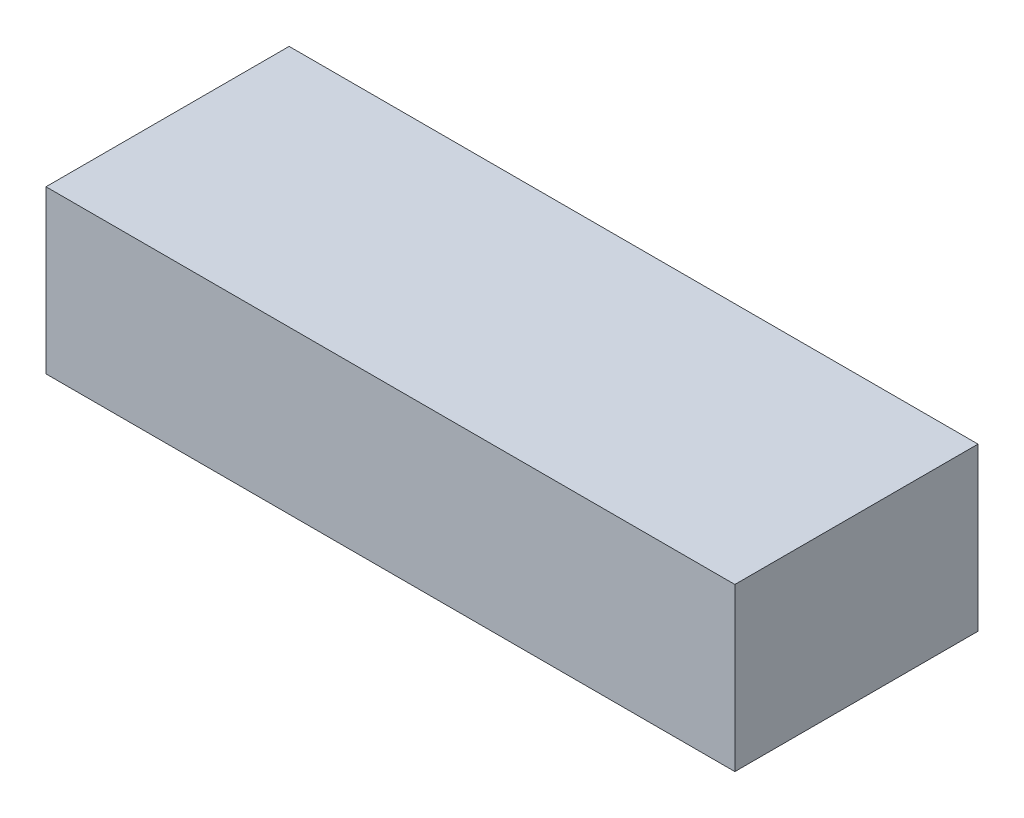
ISO-10303-21;
HEADER;
FILE_DESCRIPTION(('STEP AP214'),'2;1');
FILE_NAME('part.step','',(''),(''),'','','');
FILE_SCHEMA(('AUTOMOTIVE_DESIGN { 1 0 10303 214 1 1 1 1 }'));
ENDSEC;
DATA;
#1=APPLICATION_CONTEXT('core data for automotive mechanical design processes');
#2=APPLICATION_PROTOCOL_DEFINITION('international standard','automotive_design',2000,#1);
#3=PRODUCT_CONTEXT('',#1,'mechanical');
#4=PRODUCT('Part','Part','',(#3));
#5=PRODUCT_RELATED_PRODUCT_CATEGORY('part','',(#4));
#6=PRODUCT_DEFINITION_FORMATION('','',#4);
#7=PRODUCT_DEFINITION_CONTEXT('part definition',#1,'design');
#8=PRODUCT_DEFINITION('design','',#6,#7);
#9=PRODUCT_DEFINITION_SHAPE('','',#8);
#10=(LENGTH_UNIT() NAMED_UNIT(*) SI_UNIT(.MILLI.,.METRE.));
#11=(NAMED_UNIT(*) PLANE_ANGLE_UNIT() SI_UNIT($,.RADIAN.));
#12=(NAMED_UNIT(*) SI_UNIT($,.STERADIAN.) SOLID_ANGLE_UNIT());
#13=UNCERTAINTY_MEASURE_WITH_UNIT(LENGTH_MEASURE(1.E-05),#10,'distance_accuracy_value','');
#14=(GEOMETRIC_REPRESENTATION_CONTEXT(3) GLOBAL_UNCERTAINTY_ASSIGNED_CONTEXT((#13)) GLOBAL_UNIT_ASSIGNED_CONTEXT((#10,
#11,#12)) REPRESENTATION_CONTEXT('',''));
#15=CARTESIAN_POINT('',(0.,0.,0.));
#16=DIRECTION('',(0.,0.,1.));
#17=DIRECTION('',(1.,0.,0.));
#18=AXIS2_PLACEMENT_3D('',#15,#16,#17);
#19=CARTESIAN_POINT('',(34.,16.,12.));
#20=DIRECTION('',(-1.,0.,0.));
#21=DIRECTION('',(0.,0.,1.));
#22=AXIS2_PLACEMENT_3D('',#19,#20,#21);
#23=PLANE('',#22);
#24=DIRECTION('',(0.,0.,-1.));
#25=VECTOR('',#24,1.);
#26=CARTESIAN_POINT('',(34.,0.,12.));
#27=LINE('',#26,#25);
#28=CARTESIAN_POINT('',(34.,0.,12.));
#29=VERTEX_POINT('',#28);
#30=CARTESIAN_POINT('',(34.,0.,-12.));
#31=VERTEX_POINT('',#30);
#32=EDGE_CURVE('E104',#29,#31,#27,.T.);
#33=ORIENTED_EDGE('',*,*,#32,.T.);
#34=DIRECTION('',(0.,-1.,0.));
#35=VECTOR('',#34,1.);
#36=CARTESIAN_POINT('',(34.,16.,-12.));
#37=LINE('',#36,#35);
#38=CARTESIAN_POINT('',(34.,16.,-12.));
#39=VERTEX_POINT('',#38);
#40=EDGE_CURVE('E11',#39,#31,#37,.T.);
#41=ORIENTED_EDGE('',*,*,#40,.F.);
#42=DIRECTION('',(0.,0.,-1.));
#43=VECTOR('',#42,1.);
#44=CARTESIAN_POINT('',(34.,16.,12.));
#45=LINE('',#44,#43);
#46=CARTESIAN_POINT('',(34.,16.,12.));
#47=VERTEX_POINT('',#46);
#48=EDGE_CURVE('E92',#47,#39,#45,.T.);
#49=ORIENTED_EDGE('',*,*,#48,.F.);
#50=DIRECTION('',(0.,-1.,0.));
#51=VECTOR('',#50,1.);
#52=CARTESIAN_POINT('',(34.,16.,12.));
#53=LINE('',#52,#51);
#54=EDGE_CURVE('E100',#47,#29,#53,.T.);
#55=ORIENTED_EDGE('',*,*,#54,.T.);
#56=EDGE_LOOP('',(#33,#41,#49,#55));
#57=FACE_BOUND('',#56,.T.);
#58=ADVANCED_FACE('F41',(#57),#23,.F.);
#59=CARTESIAN_POINT('',(-34.,16.,-12.));
#60=DIRECTION('',(0.,0.,1.));
#61=DIRECTION('',(1.,0.,0.));
#62=AXIS2_PLACEMENT_3D('',#59,#60,#61);
#63=PLANE('',#62);
#64=DIRECTION('',(-1.,0.,0.));
#65=VECTOR('',#64,1.);
#66=CARTESIAN_POINT('',(-34.,0.,-12.));
#67=LINE('',#66,#65);
#68=CARTESIAN_POINT('',(-34.,0.,-12.));
#69=VERTEX_POINT('',#68);
#70=EDGE_CURVE('E96',#31,#69,#67,.T.);
#71=ORIENTED_EDGE('',*,*,#70,.T.);
#72=DIRECTION('',(0.,-1.,0.));
#73=VECTOR('',#72,1.);
#74=CARTESIAN_POINT('',(-34.,16.,-12.));
#75=LINE('',#74,#73);
#76=CARTESIAN_POINT('',(-34.,16.,-12.));
#77=VERTEX_POINT('',#76);
#78=EDGE_CURVE('E49',#77,#69,#75,.T.);
#79=ORIENTED_EDGE('',*,*,#78,.F.);
#80=DIRECTION('',(-1.,0.,0.));
#81=VECTOR('',#80,1.);
#82=CARTESIAN_POINT('',(-34.,16.,-12.));
#83=LINE('',#82,#81);
#84=EDGE_CURVE('E87',#39,#77,#83,.T.);
#85=ORIENTED_EDGE('',*,*,#84,.F.);
#86=ORIENTED_EDGE('',*,*,#40,.T.);
#87=EDGE_LOOP('',(#71,#79,#85,#86));
#88=FACE_BOUND('',#87,.T.);
#89=ADVANCED_FACE('F95',(#88),#63,.F.);
#90=CARTESIAN_POINT('',(-34.,16.,12.));
#91=DIRECTION('',(1.,0.,0.));
#92=DIRECTION('',(0.,0.,-1.));
#93=AXIS2_PLACEMENT_3D('',#90,#91,#92);
#94=PLANE('',#93);
#95=DIRECTION('',(0.,0.,1.));
#96=VECTOR('',#95,1.);
#97=CARTESIAN_POINT('',(-34.,0.,12.));
#98=LINE('',#97,#96);
#99=CARTESIAN_POINT('',(-34.,0.,12.));
#100=VERTEX_POINT('',#99);
#101=EDGE_CURVE('E74',#69,#100,#98,.T.);
#102=ORIENTED_EDGE('',*,*,#101,.T.);
#103=DIRECTION('',(0.,-1.,0.));
#104=VECTOR('',#103,1.);
#105=CARTESIAN_POINT('',(-34.,16.,12.));
#106=LINE('',#105,#104);
#107=CARTESIAN_POINT('',(-34.,16.,12.));
#108=VERTEX_POINT('',#107);
#109=EDGE_CURVE('E97',#108,#100,#106,.T.);
#110=ORIENTED_EDGE('',*,*,#109,.F.);
#111=DIRECTION('',(0.,0.,1.));
#112=VECTOR('',#111,1.);
#113=CARTESIAN_POINT('',(-34.,16.,12.));
#114=LINE('',#113,#112);
#115=EDGE_CURVE('E90',#77,#108,#114,.T.);
#116=ORIENTED_EDGE('',*,*,#115,.F.);
#117=ORIENTED_EDGE('',*,*,#78,.T.);
#118=EDGE_LOOP('',(#102,#110,#116,#117));
#119=FACE_BOUND('',#118,.T.);
#120=ADVANCED_FACE('F98',(#119),#94,.F.);
#121=CARTESIAN_POINT('',(-34.,16.,12.));
#122=DIRECTION('',(0.,0.,-1.));
#123=DIRECTION('',(-1.,0.,0.));
#124=AXIS2_PLACEMENT_3D('',#121,#122,#123);
#125=PLANE('',#124);
#126=DIRECTION('',(1.,0.,0.));
#127=VECTOR('',#126,1.);
#128=CARTESIAN_POINT('',(-34.,0.,12.));
#129=LINE('',#128,#127);
#130=EDGE_CURVE('E80',#100,#29,#129,.T.);
#131=ORIENTED_EDGE('',*,*,#130,.T.);
#132=ORIENTED_EDGE('',*,*,#54,.F.);
#133=DIRECTION('',(1.,0.,0.));
#134=VECTOR('',#133,1.);
#135=CARTESIAN_POINT('',(-34.,16.,12.));
#136=LINE('',#135,#134);
#137=EDGE_CURVE('E57',#108,#47,#136,.T.);
#138=ORIENTED_EDGE('',*,*,#137,.F.);
#139=ORIENTED_EDGE('',*,*,#109,.T.);
#140=EDGE_LOOP('',(#131,#132,#138,#139));
#141=FACE_BOUND('',#140,.T.);
#142=ADVANCED_FACE('F111',(#141),#125,.F.);
#143=CARTESIAN_POINT('',(0.,16.,0.));
#144=DIRECTION('',(0.,-1.,0.));
#145=DIRECTION('',(0.,0.,-1.));
#146=AXIS2_PLACEMENT_3D('',#143,#144,#145);
#147=PLANE('',#146);
#148=ORIENTED_EDGE('',*,*,#48,.T.);
#149=ORIENTED_EDGE('',*,*,#84,.T.);
#150=ORIENTED_EDGE('',*,*,#115,.T.);
#151=ORIENTED_EDGE('',*,*,#137,.T.);
#152=EDGE_LOOP('',(#148,#149,#150,#151));
#153=FACE_BOUND('',#152,.T.);
#154=ADVANCED_FACE('F88',(#153),#147,.F.);
#155=CARTESIAN_POINT('',(0.,0.,0.));
#156=DIRECTION('',(0.,-1.,0.));
#157=DIRECTION('',(0.,0.,-1.));
#158=AXIS2_PLACEMENT_3D('',#155,#156,#157);
#159=PLANE('',#158);
#160=ORIENTED_EDGE('',*,*,#32,.F.);
#161=ORIENTED_EDGE('',*,*,#130,.F.);
#162=ORIENTED_EDGE('',*,*,#101,.F.);
#163=ORIENTED_EDGE('',*,*,#70,.F.);
#164=EDGE_LOOP('',(#160,#161,#162,#163));
#165=FACE_BOUND('',#164,.T.);
#166=ADVANCED_FACE('F114',(#165),#159,.T.);
#167=CLOSED_SHELL('',(#58,#89,#120,#142,#154,#166));
#168=MANIFOLD_SOLID_BREP('B2',#167);
#169=ADVANCED_BREP_SHAPE_REPRESENTATION('',(#18,#168),#14);
#170=SHAPE_DEFINITION_REPRESENTATION(#9,#169);
ENDSEC;
END-ISO-10303-21;
